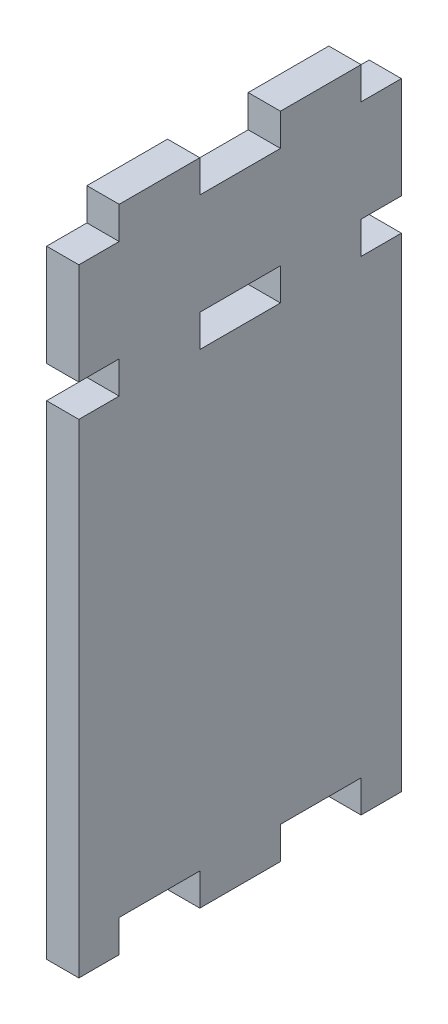
ISO-10303-21;
HEADER;
FILE_DESCRIPTION(('STEP AP214'),'2;1');
FILE_NAME('part.step','',(''),(''),'','','');
FILE_SCHEMA(('AUTOMOTIVE_DESIGN { 1 0 10303 214 1 1 1 1 }'));
ENDSEC;
DATA;
#1=APPLICATION_CONTEXT('core data for automotive mechanical design processes');
#2=APPLICATION_PROTOCOL_DEFINITION('international standard','automotive_design',2000,#1);
#3=PRODUCT_CONTEXT('',#1,'mechanical');
#4=PRODUCT('Part','Part','',(#3));
#5=PRODUCT_RELATED_PRODUCT_CATEGORY('part','',(#4));
#6=PRODUCT_DEFINITION_FORMATION('','',#4);
#7=PRODUCT_DEFINITION_CONTEXT('part definition',#1,'design');
#8=PRODUCT_DEFINITION('design','',#6,#7);
#9=PRODUCT_DEFINITION_SHAPE('','',#8);
#10=(LENGTH_UNIT() NAMED_UNIT(*) SI_UNIT(.MILLI.,.METRE.));
#11=(NAMED_UNIT(*) PLANE_ANGLE_UNIT() SI_UNIT($,.RADIAN.));
#12=(NAMED_UNIT(*) SI_UNIT($,.STERADIAN.) SOLID_ANGLE_UNIT());
#13=UNCERTAINTY_MEASURE_WITH_UNIT(LENGTH_MEASURE(1.E-05),#10,'distance_accuracy_value','');
#14=(GEOMETRIC_REPRESENTATION_CONTEXT(3) GLOBAL_UNCERTAINTY_ASSIGNED_CONTEXT((#13)) GLOBAL_UNIT_ASSIGNED_CONTEXT((#10,
#11,#12)) REPRESENTATION_CONTEXT('',''));
#15=CARTESIAN_POINT('',(0.,0.,0.));
#16=DIRECTION('',(0.,0.,1.));
#17=DIRECTION('',(1.,0.,0.));
#18=AXIS2_PLACEMENT_3D('',#15,#16,#17);
#19=CARTESIAN_POINT('',(2.,-3.15,-7.5));
#20=DIRECTION('',(0.,1.,0.));
#21=DIRECTION('',(0.,0.,1.));
#22=AXIS2_PLACEMENT_3D('',#19,#20,#21);
#23=PLANE('',#22);
#24=DIRECTION('',(0.,0.,-1.));
#25=VECTOR('',#24,1.);
#26=CARTESIAN_POINT('',(0.,-3.15,-7.5));
#27=LINE('',#26,#25);
#28=CARTESIAN_POINT('',(0.,-3.15,-7.5));
#29=VERTEX_POINT('',#28);
#30=CARTESIAN_POINT('',(0.,-3.15,-10.));
#31=VERTEX_POINT('',#30);
#32=EDGE_CURVE('E215',#29,#31,#27,.T.);
#33=ORIENTED_EDGE('',*,*,#32,.T.);
#34=DIRECTION('',(-1.,0.,0.));
#35=VECTOR('',#34,1.);
#36=CARTESIAN_POINT('',(2.,-3.15,-10.));
#37=LINE('',#36,#35);
#38=CARTESIAN_POINT('',(2.,-3.15,-10.));
#39=VERTEX_POINT('',#38);
#40=EDGE_CURVE('E11',#39,#31,#37,.T.);
#41=ORIENTED_EDGE('',*,*,#40,.F.);
#42=DIRECTION('',(0.,0.,-1.));
#43=VECTOR('',#42,1.);
#44=CARTESIAN_POINT('',(2.,-3.15,-7.5));
#45=LINE('',#44,#43);
#46=CARTESIAN_POINT('',(2.,-3.15,-7.5));
#47=VERTEX_POINT('',#46);
#48=EDGE_CURVE('E250',#47,#39,#45,.T.);
#49=ORIENTED_EDGE('',*,*,#48,.F.);
#50=DIRECTION('',(-1.,0.,0.));
#51=VECTOR('',#50,1.);
#52=CARTESIAN_POINT('',(2.,-3.15,-7.5));
#53=LINE('',#52,#51);
#54=EDGE_CURVE('E281',#47,#29,#53,.T.);
#55=ORIENTED_EDGE('',*,*,#54,.T.);
#56=EDGE_LOOP('',(#33,#41,#49,#55));
#57=FACE_BOUND('',#56,.T.);
#58=ADVANCED_FACE('F33',(#57),#23,.F.);
#59=CARTESIAN_POINT('',(2.,3.15,-10.));
#60=DIRECTION('',(0.,0.,1.));
#61=DIRECTION('',(1.,0.,0.));
#62=AXIS2_PLACEMENT_3D('',#59,#60,#61);
#63=PLANE('',#62);
#64=DIRECTION('',(0.,1.,0.));
#65=VECTOR('',#64,1.);
#66=CARTESIAN_POINT('',(0.,3.15,-10.));
#67=LINE('',#66,#65);
#68=CARTESIAN_POINT('',(0.,3.15,-10.));
#69=VERTEX_POINT('',#68);
#70=EDGE_CURVE('E284',#31,#69,#67,.T.);
#71=ORIENTED_EDGE('',*,*,#70,.T.);
#72=DIRECTION('',(-1.,0.,0.));
#73=VECTOR('',#72,1.);
#74=CARTESIAN_POINT('',(2.,3.15,-10.));
#75=LINE('',#74,#73);
#76=CARTESIAN_POINT('',(2.,3.15,-10.));
#77=VERTEX_POINT('',#76);
#78=EDGE_CURVE('E41',#77,#69,#75,.T.);
#79=ORIENTED_EDGE('',*,*,#78,.F.);
#80=DIRECTION('',(0.,1.,0.));
#81=VECTOR('',#80,1.);
#82=CARTESIAN_POINT('',(2.,3.15,-10.));
#83=LINE('',#82,#81);
#84=EDGE_CURVE('E124',#39,#77,#83,.T.);
#85=ORIENTED_EDGE('',*,*,#84,.F.);
#86=ORIENTED_EDGE('',*,*,#40,.T.);
#87=EDGE_LOOP('',(#71,#79,#85,#86));
#88=FACE_BOUND('',#87,.T.);
#89=ADVANCED_FACE('F383',(#88),#63,.F.);
#90=CARTESIAN_POINT('',(2.,3.15,-7.5));
#91=DIRECTION('',(0.,-1.,0.));
#92=DIRECTION('',(0.,0.,-1.));
#93=AXIS2_PLACEMENT_3D('',#90,#91,#92);
#94=PLANE('',#93);
#95=DIRECTION('',(0.,0.,1.));
#96=VECTOR('',#95,1.);
#97=CARTESIAN_POINT('',(0.,3.15,-7.5));
#98=LINE('',#97,#96);
#99=CARTESIAN_POINT('',(0.,3.15,-7.5));
#100=VERTEX_POINT('',#99);
#101=EDGE_CURVE('E286',#69,#100,#98,.T.);
#102=ORIENTED_EDGE('',*,*,#101,.T.);
#103=DIRECTION('',(-1.,0.,0.));
#104=VECTOR('',#103,1.);
#105=CARTESIAN_POINT('',(2.,3.15,-7.5));
#106=LINE('',#105,#104);
#107=CARTESIAN_POINT('',(2.,3.15,-7.5));
#108=VERTEX_POINT('',#107);
#109=EDGE_CURVE('E356',#108,#100,#106,.T.);
#110=ORIENTED_EDGE('',*,*,#109,.F.);
#111=DIRECTION('',(0.,0.,1.));
#112=VECTOR('',#111,1.);
#113=CARTESIAN_POINT('',(2.,3.15,-7.5));
#114=LINE('',#113,#112);
#115=EDGE_CURVE('E253',#77,#108,#114,.T.);
#116=ORIENTED_EDGE('',*,*,#115,.F.);
#117=ORIENTED_EDGE('',*,*,#78,.T.);
#118=EDGE_LOOP('',(#102,#110,#116,#117));
#119=FACE_BOUND('',#118,.T.);
#120=ADVANCED_FACE('F362',(#119),#94,.F.);
#121=CARTESIAN_POINT('',(2.,5.15,-7.5));
#122=DIRECTION('',(0.,0.,1.));
#123=DIRECTION('',(0.,-1.,0.));
#124=AXIS2_PLACEMENT_3D('',#121,#122,#123);
#125=PLANE('',#124);
#126=DIRECTION('',(0.,1.,0.));
#127=VECTOR('',#126,1.);
#128=CARTESIAN_POINT('',(0.,5.15,-7.5));
#129=LINE('',#128,#127);
#130=CARTESIAN_POINT('',(0.,5.15,-7.5));
#131=VERTEX_POINT('',#130);
#132=EDGE_CURVE('E288',#100,#131,#129,.T.);
#133=ORIENTED_EDGE('',*,*,#132,.T.);
#134=DIRECTION('',(-1.,0.,0.));
#135=VECTOR('',#134,1.);
#136=CARTESIAN_POINT('',(2.,5.15,-7.5));
#137=LINE('',#136,#135);
#138=CARTESIAN_POINT('',(2.,5.15,-7.5));
#139=VERTEX_POINT('',#138);
#140=EDGE_CURVE('E353',#139,#131,#137,.T.);
#141=ORIENTED_EDGE('',*,*,#140,.F.);
#142=DIRECTION('',(0.,1.,0.));
#143=VECTOR('',#142,1.);
#144=CARTESIAN_POINT('',(2.,5.15,-7.5));
#145=LINE('',#144,#143);
#146=EDGE_CURVE('E255',#108,#139,#145,.T.);
#147=ORIENTED_EDGE('',*,*,#146,.F.);
#148=ORIENTED_EDGE('',*,*,#109,.T.);
#149=EDGE_LOOP('',(#133,#141,#147,#148));
#150=FACE_BOUND('',#149,.T.);
#151=ADVANCED_FACE('F372',(#150),#125,.F.);
#152=CARTESIAN_POINT('',(2.,5.15,-2.5));
#153=DIRECTION('',(0.,-1.,0.));
#154=DIRECTION('',(0.,0.,-1.));
#155=AXIS2_PLACEMENT_3D('',#152,#153,#154);
#156=PLANE('',#155);
#157=DIRECTION('',(0.,0.,1.));
#158=VECTOR('',#157,1.);
#159=CARTESIAN_POINT('',(0.,5.15,-2.5));
#160=LINE('',#159,#158);
#161=CARTESIAN_POINT('',(0.,5.15,-2.5));
#162=VERTEX_POINT('',#161);
#163=EDGE_CURVE('E290',#131,#162,#160,.T.);
#164=ORIENTED_EDGE('',*,*,#163,.T.);
#165=DIRECTION('',(-1.,0.,0.));
#166=VECTOR('',#165,1.);
#167=CARTESIAN_POINT('',(2.,5.15,-2.5));
#168=LINE('',#167,#166);
#169=CARTESIAN_POINT('',(2.,5.15,-2.5));
#170=VERTEX_POINT('',#169);
#171=EDGE_CURVE('E350',#170,#162,#168,.T.);
#172=ORIENTED_EDGE('',*,*,#171,.F.);
#173=DIRECTION('',(0.,0.,1.));
#174=VECTOR('',#173,1.);
#175=CARTESIAN_POINT('',(2.,5.15,-2.5));
#176=LINE('',#175,#174);
#177=EDGE_CURVE('E257',#139,#170,#176,.T.);
#178=ORIENTED_EDGE('',*,*,#177,.F.);
#179=ORIENTED_EDGE('',*,*,#140,.T.);
#180=EDGE_LOOP('',(#164,#172,#178,#179));
#181=FACE_BOUND('',#180,.T.);
#182=ADVANCED_FACE('F376',(#181),#156,.F.);
#183=CARTESIAN_POINT('',(2.,3.15,-2.5));
#184=DIRECTION('',(0.,0.,-1.));
#185=DIRECTION('',(0.,1.,0.));
#186=AXIS2_PLACEMENT_3D('',#183,#184,#185);
#187=PLANE('',#186);
#188=DIRECTION('',(0.,-1.,0.));
#189=VECTOR('',#188,1.);
#190=CARTESIAN_POINT('',(0.,3.15,-2.5));
#191=LINE('',#190,#189);
#192=CARTESIAN_POINT('',(0.,3.15,-2.5));
#193=VERTEX_POINT('',#192);
#194=EDGE_CURVE('E292',#162,#193,#191,.T.);
#195=ORIENTED_EDGE('',*,*,#194,.T.);
#196=DIRECTION('',(-1.,0.,0.));
#197=VECTOR('',#196,1.);
#198=CARTESIAN_POINT('',(2.,3.15,-2.5));
#199=LINE('',#198,#197);
#200=CARTESIAN_POINT('',(2.,3.15,-2.5));
#201=VERTEX_POINT('',#200);
#202=EDGE_CURVE('E347',#201,#193,#199,.T.);
#203=ORIENTED_EDGE('',*,*,#202,.F.);
#204=DIRECTION('',(0.,-1.,0.));
#205=VECTOR('',#204,1.);
#206=CARTESIAN_POINT('',(2.,3.15,-2.5));
#207=LINE('',#206,#205);
#208=EDGE_CURVE('E259',#170,#201,#207,.T.);
#209=ORIENTED_EDGE('',*,*,#208,.F.);
#210=ORIENTED_EDGE('',*,*,#171,.T.);
#211=EDGE_LOOP('',(#195,#203,#209,#210));
#212=FACE_BOUND('',#211,.T.);
#213=ADVANCED_FACE('F395',(#212),#187,.F.);
#214=CARTESIAN_POINT('',(2.,3.15,2.5));
#215=DIRECTION('',(0.,-1.,0.));
#216=DIRECTION('',(0.,0.,-1.));
#217=AXIS2_PLACEMENT_3D('',#214,#215,#216);
#218=PLANE('',#217);
#219=DIRECTION('',(0.,0.,1.));
#220=VECTOR('',#219,1.);
#221=CARTESIAN_POINT('',(0.,3.15,2.5));
#222=LINE('',#221,#220);
#223=CARTESIAN_POINT('',(0.,3.15,2.5));
#224=VERTEX_POINT('',#223);
#225=EDGE_CURVE('E294',#193,#224,#222,.T.);
#226=ORIENTED_EDGE('',*,*,#225,.T.);
#227=DIRECTION('',(-1.,0.,0.));
#228=VECTOR('',#227,1.);
#229=CARTESIAN_POINT('',(2.,3.15,2.5));
#230=LINE('',#229,#228);
#231=CARTESIAN_POINT('',(2.,3.15,2.5));
#232=VERTEX_POINT('',#231);
#233=EDGE_CURVE('E344',#232,#224,#230,.T.);
#234=ORIENTED_EDGE('',*,*,#233,.F.);
#235=DIRECTION('',(0.,0.,1.));
#236=VECTOR('',#235,1.);
#237=CARTESIAN_POINT('',(2.,3.15,2.5));
#238=LINE('',#237,#236);
#239=EDGE_CURVE('E261',#201,#232,#238,.T.);
#240=ORIENTED_EDGE('',*,*,#239,.F.);
#241=ORIENTED_EDGE('',*,*,#202,.T.);
#242=EDGE_LOOP('',(#226,#234,#240,#241));
#243=FACE_BOUND('',#242,.T.);
#244=ADVANCED_FACE('F398',(#243),#218,.F.);
#245=CARTESIAN_POINT('',(2.,5.15,2.5));
#246=DIRECTION('',(0.,0.,1.));
#247=DIRECTION('',(0.,-1.,0.));
#248=AXIS2_PLACEMENT_3D('',#245,#246,#247);
#249=PLANE('',#248);
#250=DIRECTION('',(0.,1.,0.));
#251=VECTOR('',#250,1.);
#252=CARTESIAN_POINT('',(0.,5.15,2.5));
#253=LINE('',#252,#251);
#254=CARTESIAN_POINT('',(0.,5.15,2.5));
#255=VERTEX_POINT('',#254);
#256=EDGE_CURVE('E296',#224,#255,#253,.T.);
#257=ORIENTED_EDGE('',*,*,#256,.T.);
#258=DIRECTION('',(-1.,0.,0.));
#259=VECTOR('',#258,1.);
#260=CARTESIAN_POINT('',(2.,5.15,2.5));
#261=LINE('',#260,#259);
#262=CARTESIAN_POINT('',(2.,5.15,2.5));
#263=VERTEX_POINT('',#262);
#264=EDGE_CURVE('E341',#263,#255,#261,.T.);
#265=ORIENTED_EDGE('',*,*,#264,.F.);
#266=DIRECTION('',(0.,1.,0.));
#267=VECTOR('',#266,1.);
#268=CARTESIAN_POINT('',(2.,5.15,2.5));
#269=LINE('',#268,#267);
#270=EDGE_CURVE('E263',#232,#263,#269,.T.);
#271=ORIENTED_EDGE('',*,*,#270,.F.);
#272=ORIENTED_EDGE('',*,*,#233,.T.);
#273=EDGE_LOOP('',(#257,#265,#271,#272));
#274=FACE_BOUND('',#273,.T.);
#275=ADVANCED_FACE('F402',(#274),#249,.F.);
#276=CARTESIAN_POINT('',(2.,5.15,7.5));
#277=DIRECTION('',(0.,-1.,0.));
#278=DIRECTION('',(0.,0.,-1.));
#279=AXIS2_PLACEMENT_3D('',#276,#277,#278);
#280=PLANE('',#279);
#281=DIRECTION('',(0.,0.,1.));
#282=VECTOR('',#281,1.);
#283=CARTESIAN_POINT('',(0.,5.15,7.5));
#284=LINE('',#283,#282);
#285=CARTESIAN_POINT('',(0.,5.15,7.5));
#286=VERTEX_POINT('',#285);
#287=EDGE_CURVE('E298',#255,#286,#284,.T.);
#288=ORIENTED_EDGE('',*,*,#287,.T.);
#289=DIRECTION('',(-1.,0.,0.));
#290=VECTOR('',#289,1.);
#291=CARTESIAN_POINT('',(2.,5.15,7.5));
#292=LINE('',#291,#290);
#293=CARTESIAN_POINT('',(2.,5.15,7.5));
#294=VERTEX_POINT('',#293);
#295=EDGE_CURVE('E338',#294,#286,#292,.T.);
#296=ORIENTED_EDGE('',*,*,#295,.F.);
#297=DIRECTION('',(0.,0.,1.));
#298=VECTOR('',#297,1.);
#299=CARTESIAN_POINT('',(2.,5.15,7.5));
#300=LINE('',#299,#298);
#301=EDGE_CURVE('E265',#263,#294,#300,.T.);
#302=ORIENTED_EDGE('',*,*,#301,.F.);
#303=ORIENTED_EDGE('',*,*,#264,.T.);
#304=EDGE_LOOP('',(#288,#296,#302,#303));
#305=FACE_BOUND('',#304,.T.);
#306=ADVANCED_FACE('F406',(#305),#280,.F.);
#307=CARTESIAN_POINT('',(2.,3.15,7.5));
#308=DIRECTION('',(0.,0.,-1.));
#309=DIRECTION('',(-1.,0.,0.));
#310=AXIS2_PLACEMENT_3D('',#307,#308,#309);
#311=PLANE('',#310);
#312=DIRECTION('',(0.,-1.,0.));
#313=VECTOR('',#312,1.);
#314=CARTESIAN_POINT('',(0.,3.15,7.5));
#315=LINE('',#314,#313);
#316=CARTESIAN_POINT('',(0.,3.15,7.5));
#317=VERTEX_POINT('',#316);
#318=EDGE_CURVE('E300',#286,#317,#315,.T.);
#319=ORIENTED_EDGE('',*,*,#318,.T.);
#320=DIRECTION('',(-1.,0.,0.));
#321=VECTOR('',#320,1.);
#322=CARTESIAN_POINT('',(2.,3.15,7.5));
#323=LINE('',#322,#321);
#324=CARTESIAN_POINT('',(2.,3.15,7.5));
#325=VERTEX_POINT('',#324);
#326=EDGE_CURVE('E335',#325,#317,#323,.T.);
#327=ORIENTED_EDGE('',*,*,#326,.F.);
#328=DIRECTION('',(0.,-1.,0.));
#329=VECTOR('',#328,1.);
#330=CARTESIAN_POINT('',(2.,3.15,7.5));
#331=LINE('',#330,#329);
#332=EDGE_CURVE('E267',#294,#325,#331,.T.);
#333=ORIENTED_EDGE('',*,*,#332,.F.);
#334=ORIENTED_EDGE('',*,*,#295,.T.);
#335=EDGE_LOOP('',(#319,#327,#333,#334));
#336=FACE_BOUND('',#335,.T.);
#337=ADVANCED_FACE('F410',(#336),#311,.F.);
#338=CARTESIAN_POINT('',(2.,3.15,10.));
#339=DIRECTION('',(0.,-1.,0.));
#340=DIRECTION('',(0.,0.,-1.));
#341=AXIS2_PLACEMENT_3D('',#338,#339,#340);
#342=PLANE('',#341);
#343=DIRECTION('',(0.,0.,1.));
#344=VECTOR('',#343,1.);
#345=CARTESIAN_POINT('',(0.,3.15,10.));
#346=LINE('',#345,#344);
#347=CARTESIAN_POINT('',(0.,3.15,10.));
#348=VERTEX_POINT('',#347);
#349=EDGE_CURVE('E302',#317,#348,#346,.T.);
#350=ORIENTED_EDGE('',*,*,#349,.T.);
#351=DIRECTION('',(-1.,0.,0.));
#352=VECTOR('',#351,1.);
#353=CARTESIAN_POINT('',(2.,3.15,10.));
#354=LINE('',#353,#352);
#355=CARTESIAN_POINT('',(2.,3.15,10.));
#356=VERTEX_POINT('',#355);
#357=EDGE_CURVE('E332',#356,#348,#354,.T.);
#358=ORIENTED_EDGE('',*,*,#357,.F.);
#359=DIRECTION('',(0.,0.,1.));
#360=VECTOR('',#359,1.);
#361=CARTESIAN_POINT('',(2.,3.15,10.));
#362=LINE('',#361,#360);
#363=EDGE_CURVE('E269',#325,#356,#362,.T.);
#364=ORIENTED_EDGE('',*,*,#363,.F.);
#365=ORIENTED_EDGE('',*,*,#326,.T.);
#366=EDGE_LOOP('',(#350,#358,#364,#365));
#367=FACE_BOUND('',#366,.T.);
#368=ADVANCED_FACE('F414',(#367),#342,.F.);
#369=CARTESIAN_POINT('',(2.,3.15,10.));
#370=DIRECTION('',(0.,0.,-1.));
#371=DIRECTION('',(-1.,0.,0.));
#372=AXIS2_PLACEMENT_3D('',#369,#370,#371);
#373=PLANE('',#372);
#374=DIRECTION('',(0.,-1.,0.));
#375=VECTOR('',#374,1.);
#376=CARTESIAN_POINT('',(0.,3.15,10.));
#377=LINE('',#376,#375);
#378=CARTESIAN_POINT('',(0.,-3.15,10.));
#379=VERTEX_POINT('',#378);
#380=EDGE_CURVE('E304',#348,#379,#377,.T.);
#381=ORIENTED_EDGE('',*,*,#380,.T.);
#382=DIRECTION('',(-1.,0.,0.));
#383=VECTOR('',#382,1.);
#384=CARTESIAN_POINT('',(2.,-3.15,10.));
#385=LINE('',#384,#383);
#386=CARTESIAN_POINT('',(2.,-3.15,10.));
#387=VERTEX_POINT('',#386);
#388=EDGE_CURVE('E329',#387,#379,#385,.T.);
#389=ORIENTED_EDGE('',*,*,#388,.F.);
#390=DIRECTION('',(0.,-1.,0.));
#391=VECTOR('',#390,1.);
#392=CARTESIAN_POINT('',(2.,3.15,10.));
#393=LINE('',#392,#391);
#394=EDGE_CURVE('E271',#356,#387,#393,.T.);
#395=ORIENTED_EDGE('',*,*,#394,.F.);
#396=ORIENTED_EDGE('',*,*,#357,.T.);
#397=EDGE_LOOP('',(#381,#389,#395,#396));
#398=FACE_BOUND('',#397,.T.);
#399=ADVANCED_FACE('F418',(#398),#373,.F.);
#400=CARTESIAN_POINT('',(2.,-3.15,10.));
#401=DIRECTION('',(0.,1.,0.));
#402=DIRECTION('',(0.,0.,1.));
#403=AXIS2_PLACEMENT_3D('',#400,#401,#402);
#404=PLANE('',#403);
#405=DIRECTION('',(0.,0.,-1.));
#406=VECTOR('',#405,1.);
#407=CARTESIAN_POINT('',(0.,-3.15,10.));
#408=LINE('',#407,#406);
#409=CARTESIAN_POINT('',(0.,-3.15,7.5));
#410=VERTEX_POINT('',#409);
#411=EDGE_CURVE('E306',#379,#410,#408,.T.);
#412=ORIENTED_EDGE('',*,*,#411,.T.);
#413=DIRECTION('',(-1.,0.,0.));
#414=VECTOR('',#413,1.);
#415=CARTESIAN_POINT('',(2.,-3.15,7.5));
#416=LINE('',#415,#414);
#417=CARTESIAN_POINT('',(2.,-3.15,7.5));
#418=VERTEX_POINT('',#417);
#419=EDGE_CURVE('E326',#418,#410,#416,.T.);
#420=ORIENTED_EDGE('',*,*,#419,.F.);
#421=DIRECTION('',(0.,0.,-1.));
#422=VECTOR('',#421,1.);
#423=CARTESIAN_POINT('',(2.,-3.15,10.));
#424=LINE('',#423,#422);
#425=EDGE_CURVE('E273',#387,#418,#424,.T.);
#426=ORIENTED_EDGE('',*,*,#425,.F.);
#427=ORIENTED_EDGE('',*,*,#388,.T.);
#428=EDGE_LOOP('',(#412,#420,#426,#427));
#429=FACE_BOUND('',#428,.T.);
#430=ADVANCED_FACE('F422',(#429),#404,.F.);
#431=CARTESIAN_POINT('',(2.,-3.15,7.5));
#432=DIRECTION('',(0.,0.,-1.));
#433=DIRECTION('',(-1.,0.,0.));
#434=AXIS2_PLACEMENT_3D('',#431,#432,#433);
#435=PLANE('',#434);
#436=DIRECTION('',(0.,-1.,0.));
#437=VECTOR('',#436,1.);
#438=CARTESIAN_POINT('',(0.,-3.15,7.5));
#439=LINE('',#438,#437);
#440=CARTESIAN_POINT('',(0.,-5.15,7.5));
#441=VERTEX_POINT('',#440);
#442=EDGE_CURVE('E308',#410,#441,#439,.T.);
#443=ORIENTED_EDGE('',*,*,#442,.T.);
#444=DIRECTION('',(-1.,0.,0.));
#445=VECTOR('',#444,1.);
#446=CARTESIAN_POINT('',(2.,-5.15,7.5));
#447=LINE('',#446,#445);
#448=CARTESIAN_POINT('',(2.,-5.15,7.5));
#449=VERTEX_POINT('',#448);
#450=EDGE_CURVE('E323',#449,#441,#447,.T.);
#451=ORIENTED_EDGE('',*,*,#450,.F.);
#452=DIRECTION('',(0.,-1.,0.));
#453=VECTOR('',#452,1.);
#454=CARTESIAN_POINT('',(2.,-3.15,7.5));
#455=LINE('',#454,#453);
#456=EDGE_CURVE('E275',#418,#449,#455,.T.);
#457=ORIENTED_EDGE('',*,*,#456,.F.);
#458=ORIENTED_EDGE('',*,*,#419,.T.);
#459=EDGE_LOOP('',(#443,#451,#457,#458));
#460=FACE_BOUND('',#459,.T.);
#461=ADVANCED_FACE('F426',(#460),#435,.F.);
#462=CARTESIAN_POINT('',(2.,-5.15,2.5));
#463=DIRECTION('',(0.,0.,1.));
#464=DIRECTION('',(1.,0.,0.));
#465=AXIS2_PLACEMENT_3D('',#462,#463,#464);
#466=PLANE('',#465);
#467=DIRECTION('',(0.,1.,0.));
#468=VECTOR('',#467,1.);
#469=CARTESIAN_POINT('',(0.,-5.15,2.5));
#470=LINE('',#469,#468);
#471=CARTESIAN_POINT('',(0.,-5.15,2.5));
#472=VERTEX_POINT('',#471);
#473=CARTESIAN_POINT('',(0.,-3.15,2.5));
#474=VERTEX_POINT('',#473);
#475=EDGE_CURVE('E310',#472,#474,#470,.T.);
#476=ORIENTED_EDGE('',*,*,#475,.T.);
#477=DIRECTION('',(-1.,0.,0.));
#478=VECTOR('',#477,1.);
#479=CARTESIAN_POINT('',(2.,-3.15,2.5));
#480=LINE('',#479,#478);
#481=CARTESIAN_POINT('',(2.,-3.15,2.5));
#482=VERTEX_POINT('',#481);
#483=EDGE_CURVE('E319',#482,#474,#480,.T.);
#484=ORIENTED_EDGE('',*,*,#483,.F.);
#485=DIRECTION('',(0.,1.,0.));
#486=VECTOR('',#485,1.);
#487=CARTESIAN_POINT('',(2.,-5.15,2.5));
#488=LINE('',#487,#486);
#489=CARTESIAN_POINT('',(2.,-5.15,2.5));
#490=VERTEX_POINT('',#489);
#491=EDGE_CURVE('E277',#490,#482,#488,.T.);
#492=ORIENTED_EDGE('',*,*,#491,.F.);
#493=DIRECTION('',(-1.,0.,0.));
#494=VECTOR('',#493,1.);
#495=CARTESIAN_POINT('',(2.,-5.15,2.5));
#496=LINE('',#495,#494);
#497=EDGE_CURVE('E196',#490,#472,#496,.T.);
#498=ORIENTED_EDGE('',*,*,#497,.T.);
#499=EDGE_LOOP('',(#476,#484,#492,#498));
#500=FACE_BOUND('',#499,.T.);
#501=ADVANCED_FACE('F430',(#500),#466,.F.);
#502=CARTESIAN_POINT('',(2.,-3.15,2.5));
#503=DIRECTION('',(0.,1.,0.));
#504=DIRECTION('',(0.,0.,1.));
#505=AXIS2_PLACEMENT_3D('',#502,#503,#504);
#506=PLANE('',#505);
#507=DIRECTION('',(0.,0.,-1.));
#508=VECTOR('',#507,1.);
#509=CARTESIAN_POINT('',(0.,-3.15,2.5));
#510=LINE('',#509,#508);
#511=CARTESIAN_POINT('',(0.,-3.15,-2.5));
#512=VERTEX_POINT('',#511);
#513=EDGE_CURVE('E312',#474,#512,#510,.T.);
#514=ORIENTED_EDGE('',*,*,#513,.T.);
#515=DIRECTION('',(-1.,0.,0.));
#516=VECTOR('',#515,1.);
#517=CARTESIAN_POINT('',(2.,-3.15,-2.5));
#518=LINE('',#517,#516);
#519=CARTESIAN_POINT('',(2.,-3.15,-2.5));
#520=VERTEX_POINT('',#519);
#521=EDGE_CURVE('E190',#520,#512,#518,.T.);
#522=ORIENTED_EDGE('',*,*,#521,.F.);
#523=DIRECTION('',(0.,0.,-1.));
#524=VECTOR('',#523,1.);
#525=CARTESIAN_POINT('',(2.,-3.15,2.5));
#526=LINE('',#525,#524);
#527=EDGE_CURVE('E182',#482,#520,#526,.T.);
#528=ORIENTED_EDGE('',*,*,#527,.F.);
#529=ORIENTED_EDGE('',*,*,#483,.T.);
#530=EDGE_LOOP('',(#514,#522,#528,#529));
#531=FACE_BOUND('',#530,.T.);
#532=ADVANCED_FACE('F434',(#531),#506,.F.);
#533=CARTESIAN_POINT('',(2.,-5.15,-2.5));
#534=DIRECTION('',(0.,0.,-1.));
#535=DIRECTION('',(0.,1.,0.));
#536=AXIS2_PLACEMENT_3D('',#533,#534,#535);
#537=PLANE('',#536);
#538=DIRECTION('',(0.,-1.,0.));
#539=VECTOR('',#538,1.);
#540=CARTESIAN_POINT('',(0.,-5.15,-2.5));
#541=LINE('',#540,#539);
#542=CARTESIAN_POINT('',(0.,-5.15,-2.5));
#543=VERTEX_POINT('',#542);
#544=EDGE_CURVE('E109',#512,#543,#541,.T.);
#545=ORIENTED_EDGE('',*,*,#544,.T.);
#546=DIRECTION('',(-1.,0.,0.));
#547=VECTOR('',#546,1.);
#548=CARTESIAN_POINT('',(2.,-5.15,-2.5));
#549=LINE('',#548,#547);
#550=CARTESIAN_POINT('',(2.,-5.15,-2.5));
#551=VERTEX_POINT('',#550);
#552=EDGE_CURVE('E185',#551,#543,#549,.T.);
#553=ORIENTED_EDGE('',*,*,#552,.F.);
#554=DIRECTION('',(0.,-1.,0.));
#555=VECTOR('',#554,1.);
#556=CARTESIAN_POINT('',(2.,-5.15,-2.5));
#557=LINE('',#556,#555);
#558=EDGE_CURVE('E177',#520,#551,#557,.T.);
#559=ORIENTED_EDGE('',*,*,#558,.F.);
#560=ORIENTED_EDGE('',*,*,#521,.T.);
#561=EDGE_LOOP('',(#545,#553,#559,#560));
#562=FACE_BOUND('',#561,.T.);
#563=ADVANCED_FACE('F186',(#562),#537,.F.);
#564=CARTESIAN_POINT('',(2.,-3.15,-7.5));
#565=DIRECTION('',(0.,0.,1.));
#566=DIRECTION('',(0.,-1.,0.));
#567=AXIS2_PLACEMENT_3D('',#564,#565,#566);
#568=PLANE('',#567);
#569=DIRECTION('',(0.,1.,0.));
#570=VECTOR('',#569,1.);
#571=CARTESIAN_POINT('',(0.,-3.15,-7.5));
#572=LINE('',#571,#570);
#573=CARTESIAN_POINT('',(0.,-5.15,-7.5));
#574=VERTEX_POINT('',#573);
#575=EDGE_CURVE('E116',#574,#29,#572,.T.);
#576=ORIENTED_EDGE('',*,*,#575,.T.);
#577=ORIENTED_EDGE('',*,*,#54,.F.);
#578=DIRECTION('',(0.,1.,0.));
#579=VECTOR('',#578,1.);
#580=CARTESIAN_POINT('',(2.,-3.15,-7.5));
#581=LINE('',#580,#579);
#582=CARTESIAN_POINT('',(2.,-5.15,-7.5));
#583=VERTEX_POINT('',#582);
#584=EDGE_CURVE('E49',#583,#47,#581,.T.);
#585=ORIENTED_EDGE('',*,*,#584,.F.);
#586=DIRECTION('',(-1.,0.,0.));
#587=VECTOR('',#586,1.);
#588=CARTESIAN_POINT('',(2.,-5.15,-7.5));
#589=LINE('',#588,#587);
#590=EDGE_CURVE('E191',#583,#574,#589,.T.);
#591=ORIENTED_EDGE('',*,*,#590,.T.);
#592=EDGE_LOOP('',(#576,#577,#585,#591));
#593=FACE_BOUND('',#592,.T.);
#594=ADVANCED_FACE('F441',(#593),#568,.F.);
#595=CARTESIAN_POINT('',(2.,0.,0.));
#596=DIRECTION('',(-1.,0.,0.));
#597=DIRECTION('',(0.,0.,1.));
#598=AXIS2_PLACEMENT_3D('',#595,#596,#597);
#599=PLANE('',#598);
#600=DIRECTION('',(0.,0.,1.));
#601=VECTOR('',#600,1.);
#602=CARTESIAN_POINT('',(2.,-5.15,10.));
#603=LINE('',#602,#601);
#604=EDGE_CURVE('E180',#551,#490,#603,.T.);
#605=ORIENTED_EDGE('',*,*,#604,.T.);
#606=ORIENTED_EDGE('',*,*,#491,.T.);
#607=ORIENTED_EDGE('',*,*,#527,.T.);
#608=ORIENTED_EDGE('',*,*,#558,.T.);
#609=EDGE_LOOP('',(#605,#606,#607,#608));
#610=FACE_BOUND('',#609,.T.);
#611=ORIENTED_EDGE('',*,*,#48,.T.);
#612=ORIENTED_EDGE('',*,*,#84,.T.);
#613=ORIENTED_EDGE('',*,*,#115,.T.);
#614=ORIENTED_EDGE('',*,*,#146,.T.);
#615=ORIENTED_EDGE('',*,*,#177,.T.);
#616=ORIENTED_EDGE('',*,*,#208,.T.);
#617=ORIENTED_EDGE('',*,*,#239,.T.);
#618=ORIENTED_EDGE('',*,*,#270,.T.);
#619=ORIENTED_EDGE('',*,*,#301,.T.);
#620=ORIENTED_EDGE('',*,*,#332,.T.);
#621=ORIENTED_EDGE('',*,*,#363,.T.);
#622=ORIENTED_EDGE('',*,*,#394,.T.);
#623=ORIENTED_EDGE('',*,*,#425,.T.);
#624=ORIENTED_EDGE('',*,*,#456,.T.);
#625=CARTESIAN_POINT('',(2.,-5.15,10.));
#626=VERTEX_POINT('',#625);
#627=EDGE_CURVE('E198',#449,#626,#603,.T.);
#628=ORIENTED_EDGE('',*,*,#627,.T.);
#629=DIRECTION('',(0.,-1.,0.));
#630=VECTOR('',#629,1.);
#631=CARTESIAN_POINT('',(2.,-5.15,10.));
#632=LINE('',#631,#630);
#633=CARTESIAN_POINT('',(2.,-35.15,10.));
#634=VERTEX_POINT('',#633);
#635=EDGE_CURVE('E200',#626,#634,#632,.T.);
#636=ORIENTED_EDGE('',*,*,#635,.T.);
#637=DIRECTION('',(0.,0.,-1.));
#638=VECTOR('',#637,1.);
#639=CARTESIAN_POINT('',(2.,-35.15,10.));
#640=LINE('',#639,#638);
#641=CARTESIAN_POINT('',(2.,-35.15,7.5));
#642=VERTEX_POINT('',#641);
#643=EDGE_CURVE('E208',#634,#642,#640,.T.);
#644=ORIENTED_EDGE('',*,*,#643,.T.);
#645=DIRECTION('',(0.,1.,0.));
#646=VECTOR('',#645,1.);
#647=CARTESIAN_POINT('',(2.,-35.15,7.5));
#648=LINE('',#647,#646);
#649=CARTESIAN_POINT('',(2.,-33.15,7.5));
#650=VERTEX_POINT('',#649);
#651=EDGE_CURVE('E513',#642,#650,#648,.T.);
#652=ORIENTED_EDGE('',*,*,#651,.T.);
#653=DIRECTION('',(0.,0.,-1.));
#654=VECTOR('',#653,1.);
#655=CARTESIAN_POINT('',(2.,-33.15,7.5));
#656=LINE('',#655,#654);
#657=CARTESIAN_POINT('',(2.,-33.15,2.5));
#658=VERTEX_POINT('',#657);
#659=EDGE_CURVE('E565',#650,#658,#656,.T.);
#660=ORIENTED_EDGE('',*,*,#659,.T.);
#661=DIRECTION('',(0.,-1.,0.));
#662=VECTOR('',#661,1.);
#663=CARTESIAN_POINT('',(2.,-33.15,2.5));
#664=LINE('',#663,#662);
#665=CARTESIAN_POINT('',(2.,-35.15,2.5));
#666=VERTEX_POINT('',#665);
#667=EDGE_CURVE('E567',#658,#666,#664,.T.);
#668=ORIENTED_EDGE('',*,*,#667,.T.);
#669=DIRECTION('',(0.,0.,-1.));
#670=VECTOR('',#669,1.);
#671=CARTESIAN_POINT('',(2.,-35.15,2.5));
#672=LINE('',#671,#670);
#673=CARTESIAN_POINT('',(2.,-35.15,-2.5));
#674=VERTEX_POINT('',#673);
#675=EDGE_CURVE('E570',#666,#674,#672,.T.);
#676=ORIENTED_EDGE('',*,*,#675,.T.);
#677=DIRECTION('',(0.,1.,0.));
#678=VECTOR('',#677,1.);
#679=CARTESIAN_POINT('',(2.,-33.15,-2.49999999999999));
#680=LINE('',#679,#678);
#681=CARTESIAN_POINT('',(2.,-33.15,-2.49999999999999));
#682=VERTEX_POINT('',#681);
#683=EDGE_CURVE('E573',#674,#682,#680,.T.);
#684=ORIENTED_EDGE('',*,*,#683,.T.);
#685=DIRECTION('',(0.,0.,-1.));
#686=VECTOR('',#685,1.);
#687=CARTESIAN_POINT('',(2.,-33.15,-7.5));
#688=LINE('',#687,#686);
#689=CARTESIAN_POINT('',(2.,-33.15,-7.5));
#690=VERTEX_POINT('',#689);
#691=EDGE_CURVE('E576',#682,#690,#688,.T.);
#692=ORIENTED_EDGE('',*,*,#691,.T.);
#693=DIRECTION('',(0.,-1.,0.));
#694=VECTOR('',#693,1.);
#695=CARTESIAN_POINT('',(2.,-35.15,-7.5));
#696=LINE('',#695,#694);
#697=CARTESIAN_POINT('',(2.,-35.15,-7.5));
#698=VERTEX_POINT('',#697);
#699=EDGE_CURVE('E579',#690,#698,#696,.T.);
#700=ORIENTED_EDGE('',*,*,#699,.T.);
#701=DIRECTION('',(0.,0.,-1.));
#702=VECTOR('',#701,1.);
#703=CARTESIAN_POINT('',(2.,-35.15,-7.5));
#704=LINE('',#703,#702);
#705=CARTESIAN_POINT('',(2.,-35.15,-10.));
#706=VERTEX_POINT('',#705);
#707=EDGE_CURVE('E581',#698,#706,#704,.T.);
#708=ORIENTED_EDGE('',*,*,#707,.T.);
#709=DIRECTION('',(0.,1.,0.));
#710=VECTOR('',#709,1.);
#711=CARTESIAN_POINT('',(2.,-5.15,-10.));
#712=LINE('',#711,#710);
#713=CARTESIAN_POINT('',(2.,-5.15,-10.));
#714=VERTEX_POINT('',#713);
#715=EDGE_CURVE('E202',#706,#714,#712,.T.);
#716=ORIENTED_EDGE('',*,*,#715,.T.);
#717=EDGE_CURVE('E197',#714,#583,#603,.T.);
#718=ORIENTED_EDGE('',*,*,#717,.T.);
#719=ORIENTED_EDGE('',*,*,#584,.T.);
#720=EDGE_LOOP('',(#611,#612,#613,#614,#615,#616,#617,#618,#619,#620,#621,#622,#623,#624,#628,
#636,#644,#652,#660,#668,#676,#684,#692,#700,#708,#716,#718,#719));
#721=FACE_BOUND('',#720,.T.);
#722=ADVANCED_FACE('F178',(#610,#721),#599,.F.);
#723=CARTESIAN_POINT('',(0.,0.,0.));
#724=DIRECTION('',(-1.,0.,0.));
#725=DIRECTION('',(0.,0.,1.));
#726=AXIS2_PLACEMENT_3D('',#723,#724,#725);
#727=PLANE('',#726);
#728=ORIENTED_EDGE('',*,*,#475,.F.);
#729=DIRECTION('',(0.,0.,1.));
#730=VECTOR('',#729,1.);
#731=CARTESIAN_POINT('',(0.,-5.15,10.));
#732=LINE('',#731,#730);
#733=EDGE_CURVE('E597',#543,#472,#732,.T.);
#734=ORIENTED_EDGE('',*,*,#733,.F.);
#735=ORIENTED_EDGE('',*,*,#544,.F.);
#736=ORIENTED_EDGE('',*,*,#513,.F.);
#737=EDGE_LOOP('',(#728,#734,#735,#736));
#738=FACE_BOUND('',#737,.T.);
#739=ORIENTED_EDGE('',*,*,#32,.F.);
#740=ORIENTED_EDGE('',*,*,#575,.F.);
#741=CARTESIAN_POINT('',(0.,-5.15,-10.));
#742=VERTEX_POINT('',#741);
#743=EDGE_CURVE('E558',#742,#574,#732,.T.);
#744=ORIENTED_EDGE('',*,*,#743,.F.);
#745=DIRECTION('',(0.,1.,0.));
#746=VECTOR('',#745,1.);
#747=CARTESIAN_POINT('',(0.,-5.15,-10.));
#748=LINE('',#747,#746);
#749=CARTESIAN_POINT('',(0.,-35.15,-10.));
#750=VERTEX_POINT('',#749);
#751=EDGE_CURVE('E593',#750,#742,#748,.T.);
#752=ORIENTED_EDGE('',*,*,#751,.F.);
#753=DIRECTION('',(0.,0.,-1.));
#754=VECTOR('',#753,1.);
#755=CARTESIAN_POINT('',(0.,-35.15,-7.5));
#756=LINE('',#755,#754);
#757=CARTESIAN_POINT('',(0.,-35.15,-7.5));
#758=VERTEX_POINT('',#757);
#759=EDGE_CURVE('E599',#758,#750,#756,.T.);
#760=ORIENTED_EDGE('',*,*,#759,.F.);
#761=DIRECTION('',(0.,-1.,0.));
#762=VECTOR('',#761,1.);
#763=CARTESIAN_POINT('',(0.,-35.15,-7.5));
#764=LINE('',#763,#762);
#765=CARTESIAN_POINT('',(0.,-33.15,-7.5));
#766=VERTEX_POINT('',#765);
#767=EDGE_CURVE('E601',#766,#758,#764,.T.);
#768=ORIENTED_EDGE('',*,*,#767,.F.);
#769=DIRECTION('',(0.,0.,-1.));
#770=VECTOR('',#769,1.);
#771=CARTESIAN_POINT('',(0.,-33.15,-7.5));
#772=LINE('',#771,#770);
#773=CARTESIAN_POINT('',(0.,-33.15,-2.49999999999999));
#774=VERTEX_POINT('',#773);
#775=EDGE_CURVE('E606',#774,#766,#772,.T.);
#776=ORIENTED_EDGE('',*,*,#775,.F.);
#777=DIRECTION('',(0.,1.,0.));
#778=VECTOR('',#777,1.);
#779=CARTESIAN_POINT('',(0.,-33.15,-2.49999999999999));
#780=LINE('',#779,#778);
#781=CARTESIAN_POINT('',(0.,-35.15,-2.5));
#782=VERTEX_POINT('',#781);
#783=EDGE_CURVE('E609',#782,#774,#780,.T.);
#784=ORIENTED_EDGE('',*,*,#783,.F.);
#785=DIRECTION('',(0.,0.,-1.));
#786=VECTOR('',#785,1.);
#787=CARTESIAN_POINT('',(0.,-35.15,2.5));
#788=LINE('',#787,#786);
#789=CARTESIAN_POINT('',(0.,-35.15,2.5));
#790=VERTEX_POINT('',#789);
#791=EDGE_CURVE('E612',#790,#782,#788,.T.);
#792=ORIENTED_EDGE('',*,*,#791,.F.);
#793=DIRECTION('',(0.,-1.,0.));
#794=VECTOR('',#793,1.);
#795=CARTESIAN_POINT('',(0.,-33.15,2.5));
#796=LINE('',#795,#794);
#797=CARTESIAN_POINT('',(0.,-33.15,2.5));
#798=VERTEX_POINT('',#797);
#799=EDGE_CURVE('E615',#798,#790,#796,.T.);
#800=ORIENTED_EDGE('',*,*,#799,.F.);
#801=DIRECTION('',(0.,0.,-1.));
#802=VECTOR('',#801,1.);
#803=CARTESIAN_POINT('',(0.,-33.15,7.5));
#804=LINE('',#803,#802);
#805=CARTESIAN_POINT('',(0.,-33.15,7.5));
#806=VERTEX_POINT('',#805);
#807=EDGE_CURVE('E618',#806,#798,#804,.T.);
#808=ORIENTED_EDGE('',*,*,#807,.F.);
#809=DIRECTION('',(0.,1.,0.));
#810=VECTOR('',#809,1.);
#811=CARTESIAN_POINT('',(0.,-35.15,7.5));
#812=LINE('',#811,#810);
#813=CARTESIAN_POINT('',(0.,-35.15,7.5));
#814=VERTEX_POINT('',#813);
#815=EDGE_CURVE('E211',#814,#806,#812,.T.);
#816=ORIENTED_EDGE('',*,*,#815,.F.);
#817=DIRECTION('',(0.,0.,-1.));
#818=VECTOR('',#817,1.);
#819=CARTESIAN_POINT('',(0.,-35.15,10.));
#820=LINE('',#819,#818);
#821=CARTESIAN_POINT('',(0.,-35.15,10.));
#822=VERTEX_POINT('',#821);
#823=EDGE_CURVE('E249',#822,#814,#820,.T.);
#824=ORIENTED_EDGE('',*,*,#823,.F.);
#825=DIRECTION('',(0.,-1.,0.));
#826=VECTOR('',#825,1.);
#827=CARTESIAN_POINT('',(0.,-5.15,10.));
#828=LINE('',#827,#826);
#829=CARTESIAN_POINT('',(0.,-5.15,10.));
#830=VERTEX_POINT('',#829);
#831=EDGE_CURVE('E556',#830,#822,#828,.T.);
#832=ORIENTED_EDGE('',*,*,#831,.F.);
#833=EDGE_CURVE('E554',#441,#830,#732,.T.);
#834=ORIENTED_EDGE('',*,*,#833,.F.);
#835=ORIENTED_EDGE('',*,*,#442,.F.);
#836=ORIENTED_EDGE('',*,*,#411,.F.);
#837=ORIENTED_EDGE('',*,*,#380,.F.);
#838=ORIENTED_EDGE('',*,*,#349,.F.);
#839=ORIENTED_EDGE('',*,*,#318,.F.);
#840=ORIENTED_EDGE('',*,*,#287,.F.);
#841=ORIENTED_EDGE('',*,*,#256,.F.);
#842=ORIENTED_EDGE('',*,*,#225,.F.);
#843=ORIENTED_EDGE('',*,*,#194,.F.);
#844=ORIENTED_EDGE('',*,*,#163,.F.);
#845=ORIENTED_EDGE('',*,*,#132,.F.);
#846=ORIENTED_EDGE('',*,*,#101,.F.);
#847=ORIENTED_EDGE('',*,*,#70,.F.);
#848=EDGE_LOOP('',(#739,#740,#744,#752,#760,#768,#776,#784,#792,#800,#808,#816,#824,#832,#834,
#835,#836,#837,#838,#839,#840,#841,#842,#843,#844,#845,#846,#847));
#849=FACE_BOUND('',#848,.T.);
#850=ADVANCED_FACE('F367',(#738,#849),#727,.T.);
#851=CARTESIAN_POINT('',(0.,-5.15,10.));
#852=DIRECTION('',(0.,1.,0.));
#853=DIRECTION('',(0.,0.,1.));
#854=AXIS2_PLACEMENT_3D('',#851,#852,#853);
#855=PLANE('',#854);
#856=ORIENTED_EDGE('',*,*,#450,.T.);
#857=ORIENTED_EDGE('',*,*,#833,.T.);
#858=DIRECTION('',(1.,0.,0.));
#859=VECTOR('',#858,1.);
#860=CARTESIAN_POINT('',(0.,-5.15,10.));
#861=LINE('',#860,#859);
#862=EDGE_CURVE('E219',#830,#626,#861,.T.);
#863=ORIENTED_EDGE('',*,*,#862,.T.);
#864=ORIENTED_EDGE('',*,*,#627,.F.);
#865=EDGE_LOOP('',(#856,#857,#863,#864));
#866=FACE_BOUND('',#865,.T.);
#867=ADVANCED_FACE('F446',(#866),#855,.T.);
#868=ORIENTED_EDGE('',*,*,#497,.F.);
#869=ORIENTED_EDGE('',*,*,#604,.F.);
#870=ORIENTED_EDGE('',*,*,#552,.T.);
#871=ORIENTED_EDGE('',*,*,#733,.T.);
#872=EDGE_LOOP('',(#868,#869,#870,#871));
#873=FACE_BOUND('',#872,.T.);
#874=ADVANCED_FACE('F194',(#873),#855,.T.);
#875=ORIENTED_EDGE('',*,*,#590,.F.);
#876=ORIENTED_EDGE('',*,*,#717,.F.);
#877=DIRECTION('',(1.,0.,0.));
#878=VECTOR('',#877,1.);
#879=CARTESIAN_POINT('',(0.,-5.15,-10.));
#880=LINE('',#879,#878);
#881=EDGE_CURVE('E222',#742,#714,#880,.T.);
#882=ORIENTED_EDGE('',*,*,#881,.F.);
#883=ORIENTED_EDGE('',*,*,#743,.T.);
#884=EDGE_LOOP('',(#875,#876,#882,#883));
#885=FACE_BOUND('',#884,.T.);
#886=ADVANCED_FACE('F454',(#885),#855,.T.);
#887=CARTESIAN_POINT('',(0.,-35.15,7.5));
#888=DIRECTION('',(0.,0.,-1.));
#889=DIRECTION('',(-1.,0.,0.));
#890=AXIS2_PLACEMENT_3D('',#887,#888,#889);
#891=PLANE('',#890);
#892=ORIENTED_EDGE('',*,*,#651,.F.);
#893=DIRECTION('',(1.,0.,0.));
#894=VECTOR('',#893,1.);
#895=CARTESIAN_POINT('',(0.,-35.15,7.5));
#896=LINE('',#895,#894);
#897=EDGE_CURVE('E212',#814,#642,#896,.T.);
#898=ORIENTED_EDGE('',*,*,#897,.F.);
#899=ORIENTED_EDGE('',*,*,#815,.T.);
#900=DIRECTION('',(1.,0.,0.));
#901=VECTOR('',#900,1.);
#902=CARTESIAN_POINT('',(0.,-33.15,7.5));
#903=LINE('',#902,#901);
#904=EDGE_CURVE('E246',#806,#650,#903,.T.);
#905=ORIENTED_EDGE('',*,*,#904,.T.);
#906=EDGE_LOOP('',(#892,#898,#899,#905));
#907=FACE_BOUND('',#906,.T.);
#908=ADVANCED_FACE('F450',(#907),#891,.T.);
#909=CARTESIAN_POINT('',(0.,-35.15,10.));
#910=DIRECTION('',(0.,-1.,0.));
#911=DIRECTION('',(0.,0.,-1.));
#912=AXIS2_PLACEMENT_3D('',#909,#910,#911);
#913=PLANE('',#912);
#914=ORIENTED_EDGE('',*,*,#643,.F.);
#915=DIRECTION('',(1.,0.,0.));
#916=VECTOR('',#915,1.);
#917=CARTESIAN_POINT('',(0.,-35.15,10.));
#918=LINE('',#917,#916);
#919=EDGE_CURVE('E216',#822,#634,#918,.T.);
#920=ORIENTED_EDGE('',*,*,#919,.F.);
#921=ORIENTED_EDGE('',*,*,#823,.T.);
#922=ORIENTED_EDGE('',*,*,#897,.T.);
#923=EDGE_LOOP('',(#914,#920,#921,#922));
#924=FACE_BOUND('',#923,.T.);
#925=ADVANCED_FACE('F453',(#924),#913,.T.);
#926=CARTESIAN_POINT('',(0.,-5.15,10.));
#927=DIRECTION('',(0.,0.,1.));
#928=DIRECTION('',(0.,-1.,0.));
#929=AXIS2_PLACEMENT_3D('',#926,#927,#928);
#930=PLANE('',#929);
#931=ORIENTED_EDGE('',*,*,#635,.F.);
#932=ORIENTED_EDGE('',*,*,#862,.F.);
#933=ORIENTED_EDGE('',*,*,#831,.T.);
#934=ORIENTED_EDGE('',*,*,#919,.T.);
#935=EDGE_LOOP('',(#931,#932,#933,#934));
#936=FACE_BOUND('',#935,.T.);
#937=ADVANCED_FACE('F487',(#936),#930,.T.);
#938=CARTESIAN_POINT('',(0.,-5.15,-10.));
#939=DIRECTION('',(0.,0.,-1.));
#940=DIRECTION('',(0.,1.,0.));
#941=AXIS2_PLACEMENT_3D('',#938,#939,#940);
#942=PLANE('',#941);
#943=ORIENTED_EDGE('',*,*,#715,.F.);
#944=DIRECTION('',(1.,0.,0.));
#945=VECTOR('',#944,1.);
#946=CARTESIAN_POINT('',(0.,-35.15,-10.));
#947=LINE('',#946,#945);
#948=EDGE_CURVE('E225',#750,#706,#947,.T.);
#949=ORIENTED_EDGE('',*,*,#948,.F.);
#950=ORIENTED_EDGE('',*,*,#751,.T.);
#951=ORIENTED_EDGE('',*,*,#881,.T.);
#952=EDGE_LOOP('',(#943,#949,#950,#951));
#953=FACE_BOUND('',#952,.T.);
#954=ADVANCED_FACE('F483',(#953),#942,.T.);
#955=CARTESIAN_POINT('',(0.,-35.15,-7.5));
#956=DIRECTION('',(0.,-1.,0.));
#957=DIRECTION('',(0.,0.,-1.));
#958=AXIS2_PLACEMENT_3D('',#955,#956,#957);
#959=PLANE('',#958);
#960=ORIENTED_EDGE('',*,*,#707,.F.);
#961=DIRECTION('',(1.,0.,0.));
#962=VECTOR('',#961,1.);
#963=CARTESIAN_POINT('',(0.,-35.15,-7.5));
#964=LINE('',#963,#962);
#965=EDGE_CURVE('E228',#758,#698,#964,.T.);
#966=ORIENTED_EDGE('',*,*,#965,.F.);
#967=ORIENTED_EDGE('',*,*,#759,.T.);
#968=ORIENTED_EDGE('',*,*,#948,.T.);
#969=EDGE_LOOP('',(#960,#966,#967,#968));
#970=FACE_BOUND('',#969,.T.);
#971=ADVANCED_FACE('F479',(#970),#959,.T.);
#972=CARTESIAN_POINT('',(0.,-35.15,-7.5));
#973=DIRECTION('',(0.,0.,1.));
#974=DIRECTION('',(0.,-1.,0.));
#975=AXIS2_PLACEMENT_3D('',#972,#973,#974);
#976=PLANE('',#975);
#977=ORIENTED_EDGE('',*,*,#699,.F.);
#978=DIRECTION('',(1.,0.,0.));
#979=VECTOR('',#978,1.);
#980=CARTESIAN_POINT('',(0.,-33.15,-7.5));
#981=LINE('',#980,#979);
#982=EDGE_CURVE('E231',#766,#690,#981,.T.);
#983=ORIENTED_EDGE('',*,*,#982,.F.);
#984=ORIENTED_EDGE('',*,*,#767,.T.);
#985=ORIENTED_EDGE('',*,*,#965,.T.);
#986=EDGE_LOOP('',(#977,#983,#984,#985));
#987=FACE_BOUND('',#986,.T.);
#988=ADVANCED_FACE('F475',(#987),#976,.T.);
#989=CARTESIAN_POINT('',(0.,-33.15,-7.5));
#990=DIRECTION('',(0.,-1.,0.));
#991=DIRECTION('',(0.,0.,-1.));
#992=AXIS2_PLACEMENT_3D('',#989,#990,#991);
#993=PLANE('',#992);
#994=ORIENTED_EDGE('',*,*,#691,.F.);
#995=DIRECTION('',(1.,0.,0.));
#996=VECTOR('',#995,1.);
#997=CARTESIAN_POINT('',(0.,-33.15,-2.49999999999999));
#998=LINE('',#997,#996);
#999=EDGE_CURVE('E234',#774,#682,#998,.T.);
#1000=ORIENTED_EDGE('',*,*,#999,.F.);
#1001=ORIENTED_EDGE('',*,*,#775,.T.);
#1002=ORIENTED_EDGE('',*,*,#982,.T.);
#1003=EDGE_LOOP('',(#994,#1000,#1001,#1002));
#1004=FACE_BOUND('',#1003,.T.);
#1005=ADVANCED_FACE('F471',(#1004),#993,.T.);
#1006=CARTESIAN_POINT('',(0.,-33.15,-2.49999999999999));
#1007=DIRECTION('',(0.,0.,-1.));
#1008=DIRECTION('',(0.,1.,0.));
#1009=AXIS2_PLACEMENT_3D('',#1006,#1007,#1008);
#1010=PLANE('',#1009);
#1011=ORIENTED_EDGE('',*,*,#683,.F.);
#1012=DIRECTION('',(1.,0.,0.));
#1013=VECTOR('',#1012,1.);
#1014=CARTESIAN_POINT('',(0.,-35.15,-2.5));
#1015=LINE('',#1014,#1013);
#1016=EDGE_CURVE('E237',#782,#674,#1015,.T.);
#1017=ORIENTED_EDGE('',*,*,#1016,.F.);
#1018=ORIENTED_EDGE('',*,*,#783,.T.);
#1019=ORIENTED_EDGE('',*,*,#999,.T.);
#1020=EDGE_LOOP('',(#1011,#1017,#1018,#1019));
#1021=FACE_BOUND('',#1020,.T.);
#1022=ADVANCED_FACE('F467',(#1021),#1010,.T.);
#1023=CARTESIAN_POINT('',(0.,-35.15,2.5));
#1024=DIRECTION('',(0.,-1.,0.));
#1025=DIRECTION('',(0.,0.,-1.));
#1026=AXIS2_PLACEMENT_3D('',#1023,#1024,#1025);
#1027=PLANE('',#1026);
#1028=ORIENTED_EDGE('',*,*,#675,.F.);
#1029=DIRECTION('',(1.,0.,0.));
#1030=VECTOR('',#1029,1.);
#1031=CARTESIAN_POINT('',(0.,-35.15,2.5));
#1032=LINE('',#1031,#1030);
#1033=EDGE_CURVE('E240',#790,#666,#1032,.T.);
#1034=ORIENTED_EDGE('',*,*,#1033,.F.);
#1035=ORIENTED_EDGE('',*,*,#791,.T.);
#1036=ORIENTED_EDGE('',*,*,#1016,.T.);
#1037=EDGE_LOOP('',(#1028,#1034,#1035,#1036));
#1038=FACE_BOUND('',#1037,.T.);
#1039=ADVANCED_FACE('F463',(#1038),#1027,.T.);
#1040=CARTESIAN_POINT('',(0.,-33.15,2.5));
#1041=DIRECTION('',(0.,0.,1.));
#1042=DIRECTION('',(0.,-1.,0.));
#1043=AXIS2_PLACEMENT_3D('',#1040,#1041,#1042);
#1044=PLANE('',#1043);
#1045=ORIENTED_EDGE('',*,*,#667,.F.);
#1046=DIRECTION('',(1.,0.,0.));
#1047=VECTOR('',#1046,1.);
#1048=CARTESIAN_POINT('',(0.,-33.15,2.5));
#1049=LINE('',#1048,#1047);
#1050=EDGE_CURVE('E243',#798,#658,#1049,.T.);
#1051=ORIENTED_EDGE('',*,*,#1050,.F.);
#1052=ORIENTED_EDGE('',*,*,#799,.T.);
#1053=ORIENTED_EDGE('',*,*,#1033,.T.);
#1054=EDGE_LOOP('',(#1045,#1051,#1052,#1053));
#1055=FACE_BOUND('',#1054,.T.);
#1056=ADVANCED_FACE('F459',(#1055),#1044,.T.);
#1057=CARTESIAN_POINT('',(0.,-33.15,7.5));
#1058=DIRECTION('',(0.,-1.,0.));
#1059=DIRECTION('',(0.,0.,-1.));
#1060=AXIS2_PLACEMENT_3D('',#1057,#1058,#1059);
#1061=PLANE('',#1060);
#1062=ORIENTED_EDGE('',*,*,#659,.F.);
#1063=ORIENTED_EDGE('',*,*,#904,.F.);
#1064=ORIENTED_EDGE('',*,*,#807,.T.);
#1065=ORIENTED_EDGE('',*,*,#1050,.T.);
#1066=EDGE_LOOP('',(#1062,#1063,#1064,#1065));
#1067=FACE_BOUND('',#1066,.T.);
#1068=ADVANCED_FACE('F456',(#1067),#1061,.T.);
#1069=CLOSED_SHELL('',(#58,#89,#120,#151,#182,#213,#244,#275,#306,#337,#368,#399,#430,#461,#501,
#532,#563,#594,#722,#850,#867,#874,#886,#908,#925,#937,#954,#971,#988,#1005,#1022,#1039,#1056,#1068));
#1070=MANIFOLD_SOLID_BREP('B2',#1069);
#1071=ADVANCED_BREP_SHAPE_REPRESENTATION('',(#18,#1070),#14);
#1072=SHAPE_DEFINITION_REPRESENTATION(#9,#1071);
ENDSEC;
END-ISO-10303-21;
